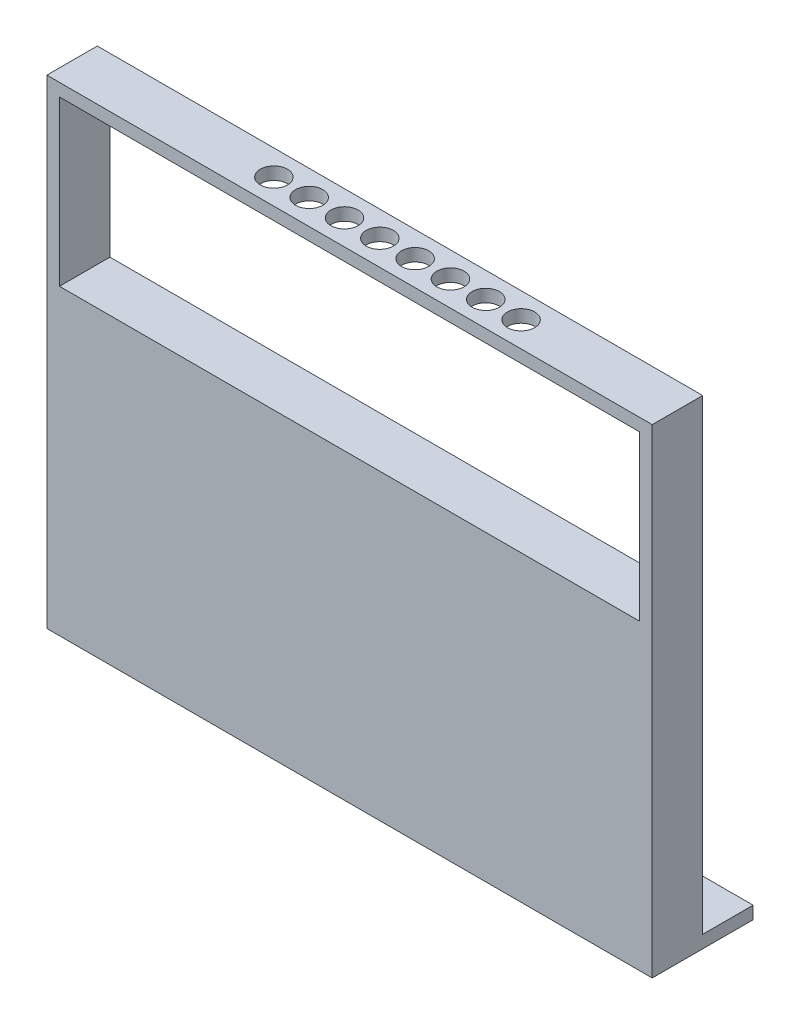
ISO-10303-21;
HEADER;
FILE_DESCRIPTION(('STEP AP214'),'2;1');
FILE_NAME('part.step','',(''),(''),'','','');
FILE_SCHEMA(('AUTOMOTIVE_DESIGN { 1 0 10303 214 1 1 1 1 }'));
ENDSEC;
DATA;
#1=APPLICATION_CONTEXT('core data for automotive mechanical design processes');
#2=APPLICATION_PROTOCOL_DEFINITION('international standard','automotive_design',2000,#1);
#3=PRODUCT_CONTEXT('',#1,'mechanical');
#4=PRODUCT('Part','Part','',(#3));
#5=PRODUCT_RELATED_PRODUCT_CATEGORY('part','',(#4));
#6=PRODUCT_DEFINITION_FORMATION('','',#4);
#7=PRODUCT_DEFINITION_CONTEXT('part definition',#1,'design');
#8=PRODUCT_DEFINITION('design','',#6,#7);
#9=PRODUCT_DEFINITION_SHAPE('','',#8);
#10=(LENGTH_UNIT() NAMED_UNIT(*) SI_UNIT(.MILLI.,.METRE.));
#11=(NAMED_UNIT(*) PLANE_ANGLE_UNIT() SI_UNIT($,.RADIAN.));
#12=(NAMED_UNIT(*) SI_UNIT($,.STERADIAN.) SOLID_ANGLE_UNIT());
#13=UNCERTAINTY_MEASURE_WITH_UNIT(LENGTH_MEASURE(1.E-05),#10,'distance_accuracy_value','');
#14=(GEOMETRIC_REPRESENTATION_CONTEXT(3) GLOBAL_UNCERTAINTY_ASSIGNED_CONTEXT((#13)) GLOBAL_UNIT_ASSIGNED_CONTEXT((#10,
#11,#12)) REPRESENTATION_CONTEXT('',''));
#15=CARTESIAN_POINT('',(0.,0.,0.));
#16=DIRECTION('',(0.,0.,1.));
#17=DIRECTION('',(1.,0.,0.));
#18=AXIS2_PLACEMENT_3D('',#15,#16,#17);
#19=CARTESIAN_POINT('',(-76.2,76.2,-6.35));
#20=DIRECTION('',(0.,0.,1.));
#21=DIRECTION('',(1.,0.,0.));
#22=AXIS2_PLACEMENT_3D('',#19,#20,#21);
#23=PLANE('',#22);
#24=DIRECTION('',(-1.,0.,0.));
#25=VECTOR('',#24,1.);
#26=CARTESIAN_POINT('',(-76.2,76.2,-6.35));
#27=LINE('',#26,#25);
#28=CARTESIAN_POINT('',(73.025,76.2,-6.34999999999999));
#29=VERTEX_POINT('',#28);
#30=CARTESIAN_POINT('',(-73.025,76.2,-6.35));
#31=VERTEX_POINT('',#30);
#32=EDGE_CURVE('E212',#29,#31,#27,.T.);
#33=ORIENTED_EDGE('',*,*,#32,.F.);
#34=DIRECTION('',(0.,1.,0.));
#35=VECTOR('',#34,1.);
#36=CARTESIAN_POINT('',(73.025,76.2,-6.34999999999999));
#37=LINE('',#36,#35);
#38=CARTESIAN_POINT('',(73.025,117.475,-6.34999999999999));
#39=VERTEX_POINT('',#38);
#40=EDGE_CURVE('E253',#29,#39,#37,.T.);
#41=ORIENTED_EDGE('',*,*,#40,.T.);
#42=DIRECTION('',(-1.,0.,0.));
#43=VECTOR('',#42,1.);
#44=CARTESIAN_POINT('',(73.025,117.475,-6.34999999999999));
#45=LINE('',#44,#43);
#46=CARTESIAN_POINT('',(-73.025,117.475,-6.34999999999999));
#47=VERTEX_POINT('',#46);
#48=EDGE_CURVE('E147',#39,#47,#45,.T.);
#49=ORIENTED_EDGE('',*,*,#48,.T.);
#50=DIRECTION('',(0.,-1.,0.));
#51=VECTOR('',#50,1.);
#52=CARTESIAN_POINT('',(-73.025,117.475,-6.34999999999999));
#53=LINE('',#52,#51);
#54=EDGE_CURVE('E115',#47,#31,#53,.T.);
#55=ORIENTED_EDGE('',*,*,#54,.T.);
#56=EDGE_LOOP('',(#33,#41,#49,#55));
#57=FACE_BOUND('',#56,.T.);
#58=DIRECTION('',(1.,0.,0.));
#59=VECTOR('',#58,1.);
#60=CARTESIAN_POINT('',(-76.2,3.175,-6.35));
#61=LINE('',#60,#59);
#62=CARTESIAN_POINT('',(-76.2,3.17500000000003,-6.35));
#63=VERTEX_POINT('',#62);
#64=CARTESIAN_POINT('',(76.2,3.175,-6.35));
#65=VERTEX_POINT('',#64);
#66=EDGE_CURVE('E196',#63,#65,#61,.T.);
#67=ORIENTED_EDGE('',*,*,#66,.F.);
#68=DIRECTION('',(0.,-1.,0.));
#69=VECTOR('',#68,1.);
#70=CARTESIAN_POINT('',(-76.2,76.2,-6.35));
#71=LINE('',#70,#69);
#72=CARTESIAN_POINT('',(-76.2,120.65,-6.34999999999999));
#73=VERTEX_POINT('',#72);
#74=EDGE_CURVE('E41',#73,#63,#71,.T.);
#75=ORIENTED_EDGE('',*,*,#74,.F.);
#76=DIRECTION('',(1.,0.,0.));
#77=VECTOR('',#76,1.);
#78=CARTESIAN_POINT('',(-76.2,120.65,-6.34999999999999));
#79=LINE('',#78,#77);
#80=CARTESIAN_POINT('',(76.2,120.65,-6.34999999999999));
#81=VERTEX_POINT('',#80);
#82=EDGE_CURVE('E137',#73,#81,#79,.T.);
#83=ORIENTED_EDGE('',*,*,#82,.T.);
#84=DIRECTION('',(0.,-1.,0.));
#85=VECTOR('',#84,1.);
#86=CARTESIAN_POINT('',(76.2,76.2,-6.35));
#87=LINE('',#86,#85);
#88=EDGE_CURVE('E11',#81,#65,#87,.T.);
#89=ORIENTED_EDGE('',*,*,#88,.T.);
#90=EDGE_LOOP('',(#67,#75,#83,#89));
#91=FACE_BOUND('',#90,.T.);
#92=ADVANCED_FACE('F33',(#57,#91),#23,.F.);
#93=CARTESIAN_POINT('',(76.2,76.2,6.35));
#94=DIRECTION('',(-1.,0.,0.));
#95=DIRECTION('',(0.,0.,1.));
#96=AXIS2_PLACEMENT_3D('',#93,#94,#95);
#97=PLANE('',#96);
#98=DIRECTION('',(0.,0.,-1.));
#99=VECTOR('',#98,1.);
#100=CARTESIAN_POINT('',(76.2,0.,6.35));
#101=LINE('',#100,#99);
#102=CARTESIAN_POINT('',(76.2,0.,6.35));
#103=VERTEX_POINT('',#102);
#104=CARTESIAN_POINT('',(76.2,0.,-19.05));
#105=VERTEX_POINT('',#104);
#106=EDGE_CURVE('E211',#103,#105,#101,.T.);
#107=ORIENTED_EDGE('',*,*,#106,.T.);
#108=DIRECTION('',(0.,-1.,0.));
#109=VECTOR('',#108,1.);
#110=CARTESIAN_POINT('',(76.2,3.175,-19.05));
#111=LINE('',#110,#109);
#112=CARTESIAN_POINT('',(76.2,3.175,-19.05));
#113=VERTEX_POINT('',#112);
#114=EDGE_CURVE('E208',#113,#105,#111,.T.);
#115=ORIENTED_EDGE('',*,*,#114,.F.);
#116=DIRECTION('',(0.,0.,-1.));
#117=VECTOR('',#116,1.);
#118=CARTESIAN_POINT('',(76.2,3.175,-6.35));
#119=LINE('',#118,#117);
#120=EDGE_CURVE('E199',#65,#113,#119,.T.);
#121=ORIENTED_EDGE('',*,*,#120,.F.);
#122=ORIENTED_EDGE('',*,*,#88,.F.);
#123=DIRECTION('',(0.,0.,1.));
#124=VECTOR('',#123,1.);
#125=CARTESIAN_POINT('',(76.2,120.65,-165.1));
#126=LINE('',#125,#124);
#127=CARTESIAN_POINT('',(76.2,120.65,6.35));
#128=VERTEX_POINT('',#127);
#129=EDGE_CURVE('E148',#81,#128,#126,.T.);
#130=ORIENTED_EDGE('',*,*,#129,.T.);
#131=DIRECTION('',(0.,-1.,0.));
#132=VECTOR('',#131,1.);
#133=CARTESIAN_POINT('',(76.2,76.2,6.35));
#134=LINE('',#133,#132);
#135=EDGE_CURVE('E216',#128,#103,#134,.T.);
#136=ORIENTED_EDGE('',*,*,#135,.T.);
#137=EDGE_LOOP('',(#107,#115,#121,#122,#130,#136));
#138=FACE_BOUND('',#137,.T.);
#139=ADVANCED_FACE('F35',(#138),#97,.F.);
#140=CARTESIAN_POINT('',(-76.2,76.2,6.35));
#141=DIRECTION('',(1.,0.,0.));
#142=DIRECTION('',(0.,0.,-1.));
#143=AXIS2_PLACEMENT_3D('',#140,#141,#142);
#144=PLANE('',#143);
#145=DIRECTION('',(0.,0.,1.));
#146=VECTOR('',#145,1.);
#147=CARTESIAN_POINT('',(-76.2,0.,6.35));
#148=LINE('',#147,#146);
#149=CARTESIAN_POINT('',(-76.2,0.,-19.05));
#150=VERTEX_POINT('',#149);
#151=CARTESIAN_POINT('',(-76.2,0.,6.35));
#152=VERTEX_POINT('',#151);
#153=EDGE_CURVE('E218',#150,#152,#148,.T.);
#154=ORIENTED_EDGE('',*,*,#153,.T.);
#155=DIRECTION('',(0.,-1.,0.));
#156=VECTOR('',#155,1.);
#157=CARTESIAN_POINT('',(-76.2,76.2,6.35));
#158=LINE('',#157,#156);
#159=CARTESIAN_POINT('',(-76.2,120.65,6.35));
#160=VERTEX_POINT('',#159);
#161=EDGE_CURVE('E223',#160,#152,#158,.T.);
#162=ORIENTED_EDGE('',*,*,#161,.F.);
#163=DIRECTION('',(0.,0.,1.));
#164=VECTOR('',#163,1.);
#165=CARTESIAN_POINT('',(-76.2,120.65,-165.1));
#166=LINE('',#165,#164);
#167=EDGE_CURVE('E144',#73,#160,#166,.T.);
#168=ORIENTED_EDGE('',*,*,#167,.F.);
#169=ORIENTED_EDGE('',*,*,#74,.T.);
#170=DIRECTION('',(0.,0.,1.));
#171=VECTOR('',#170,1.);
#172=CARTESIAN_POINT('',(-76.2,3.175,-12.7));
#173=LINE('',#172,#171);
#174=CARTESIAN_POINT('',(-76.2,3.175,-19.05));
#175=VERTEX_POINT('',#174);
#176=EDGE_CURVE('E193',#175,#63,#173,.T.);
#177=ORIENTED_EDGE('',*,*,#176,.F.);
#178=DIRECTION('',(0.,-1.,0.));
#179=VECTOR('',#178,1.);
#180=CARTESIAN_POINT('',(-76.2,3.175,-19.05));
#181=LINE('',#180,#179);
#182=EDGE_CURVE('E203',#175,#150,#181,.T.);
#183=ORIENTED_EDGE('',*,*,#182,.T.);
#184=EDGE_LOOP('',(#154,#162,#168,#169,#177,#183));
#185=FACE_BOUND('',#184,.T.);
#186=ADVANCED_FACE('F229',(#185),#144,.F.);
#187=CARTESIAN_POINT('',(-76.2,76.2,6.35));
#188=DIRECTION('',(0.,0.,-1.));
#189=DIRECTION('',(-1.,0.,0.));
#190=AXIS2_PLACEMENT_3D('',#187,#188,#189);
#191=PLANE('',#190);
#192=DIRECTION('',(1.,0.,0.));
#193=VECTOR('',#192,1.);
#194=CARTESIAN_POINT('',(-76.2,76.2,6.35));
#195=LINE('',#194,#193);
#196=CARTESIAN_POINT('',(-73.025,76.2,6.35));
#197=VERTEX_POINT('',#196);
#198=CARTESIAN_POINT('',(73.025,76.2,6.35));
#199=VERTEX_POINT('',#198);
#200=EDGE_CURVE('E48',#197,#199,#195,.T.);
#201=ORIENTED_EDGE('',*,*,#200,.F.);
#202=DIRECTION('',(0.,1.,0.));
#203=VECTOR('',#202,1.);
#204=CARTESIAN_POINT('',(-73.025,117.475,6.35));
#205=LINE('',#204,#203);
#206=CARTESIAN_POINT('',(-73.025,117.475,6.35));
#207=VERTEX_POINT('',#206);
#208=EDGE_CURVE('E113',#197,#207,#205,.T.);
#209=ORIENTED_EDGE('',*,*,#208,.T.);
#210=DIRECTION('',(1.,0.,0.));
#211=VECTOR('',#210,1.);
#212=CARTESIAN_POINT('',(73.025,117.475,6.35));
#213=LINE('',#212,#211);
#214=CARTESIAN_POINT('',(73.025,117.475,6.35));
#215=VERTEX_POINT('',#214);
#216=EDGE_CURVE('E121',#207,#215,#213,.T.);
#217=ORIENTED_EDGE('',*,*,#216,.T.);
#218=DIRECTION('',(0.,-1.,0.));
#219=VECTOR('',#218,1.);
#220=CARTESIAN_POINT('',(73.025,76.2,6.35));
#221=LINE('',#220,#219);
#222=EDGE_CURVE('E127',#215,#199,#221,.T.);
#223=ORIENTED_EDGE('',*,*,#222,.T.);
#224=EDGE_LOOP('',(#201,#209,#217,#223));
#225=FACE_BOUND('',#224,.T.);
#226=DIRECTION('',(1.,0.,0.));
#227=VECTOR('',#226,1.);
#228=CARTESIAN_POINT('',(-76.2,0.,6.35));
#229=LINE('',#228,#227);
#230=EDGE_CURVE('E214',#152,#103,#229,.T.);
#231=ORIENTED_EDGE('',*,*,#230,.T.);
#232=ORIENTED_EDGE('',*,*,#135,.F.);
#233=DIRECTION('',(-1.,0.,0.));
#234=VECTOR('',#233,1.);
#235=CARTESIAN_POINT('',(-76.2,120.65,6.35));
#236=LINE('',#235,#234);
#237=EDGE_CURVE('E141',#128,#160,#236,.T.);
#238=ORIENTED_EDGE('',*,*,#237,.T.);
#239=ORIENTED_EDGE('',*,*,#161,.T.);
#240=EDGE_LOOP('',(#231,#232,#238,#239));
#241=FACE_BOUND('',#240,.T.);
#242=ADVANCED_FACE('F129',(#225,#241),#191,.F.);
#243=CARTESIAN_POINT('',(0.,76.2,0.));
#244=DIRECTION('',(0.,-1.,0.));
#245=DIRECTION('',(0.,0.,-1.));
#246=AXIS2_PLACEMENT_3D('',#243,#244,#245);
#247=PLANE('',#246);
#248=ORIENTED_EDGE('',*,*,#200,.T.);
#249=DIRECTION('',(0.,0.,1.));
#250=VECTOR('',#249,1.);
#251=CARTESIAN_POINT('',(73.025,76.2,-165.1));
#252=LINE('',#251,#250);
#253=EDGE_CURVE('E151',#29,#199,#252,.T.);
#254=ORIENTED_EDGE('',*,*,#253,.F.);
#255=ORIENTED_EDGE('',*,*,#32,.T.);
#256=DIRECTION('',(0.,0.,1.));
#257=VECTOR('',#256,1.);
#258=CARTESIAN_POINT('',(-73.025,76.2,-165.1));
#259=LINE('',#258,#257);
#260=EDGE_CURVE('E53',#31,#197,#259,.T.);
#261=ORIENTED_EDGE('',*,*,#260,.T.);
#262=EDGE_LOOP('',(#248,#254,#255,#261));
#263=FACE_BOUND('',#262,.T.);
#264=ADVANCED_FACE('F347',(#263),#247,.F.);
#265=CARTESIAN_POINT('',(0.,0.,0.));
#266=DIRECTION('',(0.,-1.,0.));
#267=DIRECTION('',(0.,0.,-1.));
#268=AXIS2_PLACEMENT_3D('',#265,#266,#267);
#269=PLANE('',#268);
#270=ORIENTED_EDGE('',*,*,#106,.F.);
#271=ORIENTED_EDGE('',*,*,#230,.F.);
#272=ORIENTED_EDGE('',*,*,#153,.F.);
#273=DIRECTION('',(-1.,0.,0.));
#274=VECTOR('',#273,1.);
#275=CARTESIAN_POINT('',(76.2,0.,-19.05));
#276=LINE('',#275,#274);
#277=EDGE_CURVE('E190',#105,#150,#276,.T.);
#278=ORIENTED_EDGE('',*,*,#277,.F.);
#279=EDGE_LOOP('',(#270,#271,#272,#278));
#280=FACE_BOUND('',#279,.T.);
#281=CARTESIAN_POINT('',(-69.85,0.,-12.7));
#282=DIRECTION('',(0.,1.,0.));
#283=DIRECTION('',(0.,0.,1.));
#284=AXIS2_PLACEMENT_3D('',#281,#282,#283);
#285=CIRCLE('',#284,3.175);
#286=CARTESIAN_POINT('',(-69.85,0.,-9.52499999999999));
#287=VERTEX_POINT('',#286);
#288=EDGE_CURVE('E184',#287,#287,#285,.T.);
#289=ORIENTED_EDGE('',*,*,#288,.T.);
#290=EDGE_LOOP('',(#289));
#291=FACE_BOUND('',#290,.T.);
#292=CARTESIAN_POINT('',(-44.45,0.,-12.7));
#293=DIRECTION('',(0.,1.,0.));
#294=DIRECTION('',(0.,0.,1.));
#295=AXIS2_PLACEMENT_3D('',#292,#293,#294);
#296=CIRCLE('',#295,3.175);
#297=CARTESIAN_POINT('',(-44.45,0.,-9.52499999999999));
#298=VERTEX_POINT('',#297);
#299=EDGE_CURVE('E178',#298,#298,#296,.T.);
#300=ORIENTED_EDGE('',*,*,#299,.T.);
#301=EDGE_LOOP('',(#300));
#302=FACE_BOUND('',#301,.T.);
#303=CARTESIAN_POINT('',(-19.05,0.,-12.7));
#304=DIRECTION('',(0.,1.,0.));
#305=DIRECTION('',(0.,0.,1.));
#306=AXIS2_PLACEMENT_3D('',#303,#304,#305);
#307=CIRCLE('',#306,3.175);
#308=CARTESIAN_POINT('',(-19.05,0.,-9.52499999999999));
#309=VERTEX_POINT('',#308);
#310=EDGE_CURVE('E172',#309,#309,#307,.T.);
#311=ORIENTED_EDGE('',*,*,#310,.T.);
#312=EDGE_LOOP('',(#311));
#313=FACE_BOUND('',#312,.T.);
#314=CARTESIAN_POINT('',(6.34999999999997,0.,-12.7));
#315=DIRECTION('',(0.,1.,0.));
#316=DIRECTION('',(0.,0.,1.));
#317=AXIS2_PLACEMENT_3D('',#314,#315,#316);
#318=CIRCLE('',#317,3.175);
#319=CARTESIAN_POINT('',(6.34999999999997,0.,-9.52499999999999));
#320=VERTEX_POINT('',#319);
#321=EDGE_CURVE('E166',#320,#320,#318,.T.);
#322=ORIENTED_EDGE('',*,*,#321,.T.);
#323=EDGE_LOOP('',(#322));
#324=FACE_BOUND('',#323,.T.);
#325=CARTESIAN_POINT('',(31.75,0.,-12.7));
#326=DIRECTION('',(0.,1.,0.));
#327=DIRECTION('',(0.,0.,1.));
#328=AXIS2_PLACEMENT_3D('',#325,#326,#327);
#329=CIRCLE('',#328,3.175);
#330=CARTESIAN_POINT('',(31.75,0.,-9.52499999999999));
#331=VERTEX_POINT('',#330);
#332=EDGE_CURVE('E160',#331,#331,#329,.T.);
#333=ORIENTED_EDGE('',*,*,#332,.T.);
#334=EDGE_LOOP('',(#333));
#335=FACE_BOUND('',#334,.T.);
#336=CARTESIAN_POINT('',(57.15,0.,-12.7));
#337=DIRECTION('',(0.,1.,0.));
#338=DIRECTION('',(0.,0.,1.));
#339=AXIS2_PLACEMENT_3D('',#336,#337,#338);
#340=CIRCLE('',#339,3.175);
#341=CARTESIAN_POINT('',(57.15,0.,-9.52499999999999));
#342=VERTEX_POINT('',#341);
#343=EDGE_CURVE('E156',#342,#342,#340,.T.);
#344=ORIENTED_EDGE('',*,*,#343,.T.);
#345=EDGE_LOOP('',(#344));
#346=FACE_BOUND('',#345,.T.);
#347=ADVANCED_FACE('F247',(#280,#291,#302,#313,#324,#335,#346),#269,.T.);
#348=CARTESIAN_POINT('',(0.,3.175,0.));
#349=DIRECTION('',(0.,1.,0.));
#350=DIRECTION('',(0.,0.,1.));
#351=AXIS2_PLACEMENT_3D('',#348,#349,#350);
#352=PLANE('',#351);
#353=CARTESIAN_POINT('',(31.75,3.175,-12.7));
#354=DIRECTION('',(0.,1.,0.));
#355=DIRECTION('',(0.,0.,1.));
#356=AXIS2_PLACEMENT_3D('',#353,#354,#355);
#357=CIRCLE('',#356,3.175);
#358=CARTESIAN_POINT('',(31.75,3.175,-9.52499999999999));
#359=VERTEX_POINT('',#358);
#360=EDGE_CURVE('E163',#359,#359,#357,.T.);
#361=ORIENTED_EDGE('',*,*,#360,.F.);
#362=EDGE_LOOP('',(#361));
#363=FACE_BOUND('',#362,.T.);
#364=CARTESIAN_POINT('',(-19.05,3.175,-12.7));
#365=DIRECTION('',(0.,1.,0.));
#366=DIRECTION('',(0.,0.,1.));
#367=AXIS2_PLACEMENT_3D('',#364,#365,#366);
#368=CIRCLE('',#367,3.175);
#369=CARTESIAN_POINT('',(-19.05,3.175,-9.52499999999999));
#370=VERTEX_POINT('',#369);
#371=EDGE_CURVE('E175',#370,#370,#368,.T.);
#372=ORIENTED_EDGE('',*,*,#371,.F.);
#373=EDGE_LOOP('',(#372));
#374=FACE_BOUND('',#373,.T.);
#375=CARTESIAN_POINT('',(-69.85,3.175,-12.7));
#376=DIRECTION('',(0.,1.,0.));
#377=DIRECTION('',(0.,0.,1.));
#378=AXIS2_PLACEMENT_3D('',#375,#376,#377);
#379=CIRCLE('',#378,3.175);
#380=CARTESIAN_POINT('',(-69.85,3.175,-9.52499999999999));
#381=VERTEX_POINT('',#380);
#382=EDGE_CURVE('E187',#381,#381,#379,.T.);
#383=ORIENTED_EDGE('',*,*,#382,.F.);
#384=EDGE_LOOP('',(#383));
#385=FACE_BOUND('',#384,.T.);
#386=ORIENTED_EDGE('',*,*,#176,.T.);
#387=ORIENTED_EDGE('',*,*,#66,.T.);
#388=ORIENTED_EDGE('',*,*,#120,.T.);
#389=DIRECTION('',(-1.,0.,0.));
#390=VECTOR('',#389,1.);
#391=CARTESIAN_POINT('',(76.2,3.175,-19.05));
#392=LINE('',#391,#390);
#393=EDGE_CURVE('E201',#113,#175,#392,.T.);
#394=ORIENTED_EDGE('',*,*,#393,.T.);
#395=EDGE_LOOP('',(#386,#387,#388,#394));
#396=FACE_BOUND('',#395,.T.);
#397=CARTESIAN_POINT('',(-44.45,3.175,-12.7));
#398=DIRECTION('',(0.,1.,0.));
#399=DIRECTION('',(0.,0.,1.));
#400=AXIS2_PLACEMENT_3D('',#397,#398,#399);
#401=CIRCLE('',#400,3.175);
#402=CARTESIAN_POINT('',(-44.45,3.175,-9.52499999999999));
#403=VERTEX_POINT('',#402);
#404=EDGE_CURVE('E181',#403,#403,#401,.T.);
#405=ORIENTED_EDGE('',*,*,#404,.F.);
#406=EDGE_LOOP('',(#405));
#407=FACE_BOUND('',#406,.T.);
#408=CARTESIAN_POINT('',(6.34999999999997,3.175,-12.7));
#409=DIRECTION('',(0.,1.,0.));
#410=DIRECTION('',(0.,0.,1.));
#411=AXIS2_PLACEMENT_3D('',#408,#409,#410);
#412=CIRCLE('',#411,3.175);
#413=CARTESIAN_POINT('',(6.34999999999997,3.175,-9.52499999999999));
#414=VERTEX_POINT('',#413);
#415=EDGE_CURVE('E169',#414,#414,#412,.T.);
#416=ORIENTED_EDGE('',*,*,#415,.F.);
#417=EDGE_LOOP('',(#416));
#418=FACE_BOUND('',#417,.T.);
#419=CARTESIAN_POINT('',(57.15,3.175,-12.7));
#420=DIRECTION('',(0.,1.,0.));
#421=DIRECTION('',(0.,0.,1.));
#422=AXIS2_PLACEMENT_3D('',#419,#420,#421);
#423=CIRCLE('',#422,3.175);
#424=CARTESIAN_POINT('',(57.15,3.175,-9.52499999999999));
#425=VERTEX_POINT('',#424);
#426=EDGE_CURVE('E157',#425,#425,#423,.T.);
#427=ORIENTED_EDGE('',*,*,#426,.F.);
#428=EDGE_LOOP('',(#427));
#429=FACE_BOUND('',#428,.T.);
#430=ADVANCED_FACE('F234',(#363,#374,#385,#396,#407,#418,#429),#352,.T.);
#431=CARTESIAN_POINT('',(76.2,3.175,-19.05));
#432=DIRECTION('',(0.,0.,1.));
#433=DIRECTION('',(1.,0.,0.));
#434=AXIS2_PLACEMENT_3D('',#431,#432,#433);
#435=PLANE('',#434);
#436=ORIENTED_EDGE('',*,*,#277,.T.);
#437=ORIENTED_EDGE('',*,*,#182,.F.);
#438=ORIENTED_EDGE('',*,*,#393,.F.);
#439=ORIENTED_EDGE('',*,*,#114,.T.);
#440=EDGE_LOOP('',(#436,#437,#438,#439));
#441=FACE_BOUND('',#440,.T.);
#442=ADVANCED_FACE('F241',(#441),#435,.F.);
#443=CARTESIAN_POINT('',(-69.85,3.175,-12.7));
#444=DIRECTION('',(0.,-1.,0.));
#445=DIRECTION('',(0.,0.,-1.));
#446=AXIS2_PLACEMENT_3D('',#443,#444,#445);
#447=CYLINDRICAL_SURFACE('',#446,3.175);
#448=ORIENTED_EDGE('',*,*,#382,.T.);
#449=EDGE_LOOP('',(#448));
#450=FACE_BOUND('',#449,.T.);
#451=ORIENTED_EDGE('',*,*,#288,.F.);
#452=EDGE_LOOP('',(#451));
#453=FACE_BOUND('',#452,.T.);
#454=ADVANCED_FACE('F354',(#450,#453),#447,.F.);
#455=CARTESIAN_POINT('',(-44.45,3.175,-12.7));
#456=DIRECTION('',(0.,-1.,0.));
#457=DIRECTION('',(0.,0.,-1.));
#458=AXIS2_PLACEMENT_3D('',#455,#456,#457);
#459=CYLINDRICAL_SURFACE('',#458,3.175);
#460=ORIENTED_EDGE('',*,*,#404,.T.);
#461=EDGE_LOOP('',(#460));
#462=FACE_BOUND('',#461,.T.);
#463=ORIENTED_EDGE('',*,*,#299,.F.);
#464=EDGE_LOOP('',(#463));
#465=FACE_BOUND('',#464,.T.);
#466=ADVANCED_FACE('F360',(#462,#465),#459,.F.);
#467=CARTESIAN_POINT('',(-19.05,3.175,-12.7));
#468=DIRECTION('',(0.,-1.,0.));
#469=DIRECTION('',(0.,0.,-1.));
#470=AXIS2_PLACEMENT_3D('',#467,#468,#469);
#471=CYLINDRICAL_SURFACE('',#470,3.175);
#472=ORIENTED_EDGE('',*,*,#371,.T.);
#473=EDGE_LOOP('',(#472));
#474=FACE_BOUND('',#473,.T.);
#475=ORIENTED_EDGE('',*,*,#310,.F.);
#476=EDGE_LOOP('',(#475));
#477=FACE_BOUND('',#476,.T.);
#478=ADVANCED_FACE('F364',(#474,#477),#471,.F.);
#479=CARTESIAN_POINT('',(6.34999999999997,3.175,-12.7));
#480=DIRECTION('',(0.,-1.,0.));
#481=DIRECTION('',(0.,0.,-1.));
#482=AXIS2_PLACEMENT_3D('',#479,#480,#481);
#483=CYLINDRICAL_SURFACE('',#482,3.175);
#484=ORIENTED_EDGE('',*,*,#415,.T.);
#485=EDGE_LOOP('',(#484));
#486=FACE_BOUND('',#485,.T.);
#487=ORIENTED_EDGE('',*,*,#321,.F.);
#488=EDGE_LOOP('',(#487));
#489=FACE_BOUND('',#488,.T.);
#490=ADVANCED_FACE('F368',(#486,#489),#483,.F.);
#491=CARTESIAN_POINT('',(31.75,3.175,-12.7));
#492=DIRECTION('',(0.,-1.,0.));
#493=DIRECTION('',(0.,0.,-1.));
#494=AXIS2_PLACEMENT_3D('',#491,#492,#493);
#495=CYLINDRICAL_SURFACE('',#494,3.175);
#496=ORIENTED_EDGE('',*,*,#360,.T.);
#497=EDGE_LOOP('',(#496));
#498=FACE_BOUND('',#497,.T.);
#499=ORIENTED_EDGE('',*,*,#332,.F.);
#500=EDGE_LOOP('',(#499));
#501=FACE_BOUND('',#500,.T.);
#502=ADVANCED_FACE('F372',(#498,#501),#495,.F.);
#503=CARTESIAN_POINT('',(57.15,3.175,-12.7));
#504=DIRECTION('',(0.,-1.,0.));
#505=DIRECTION('',(0.,0.,-1.));
#506=AXIS2_PLACEMENT_3D('',#503,#504,#505);
#507=CYLINDRICAL_SURFACE('',#506,3.175);
#508=ORIENTED_EDGE('',*,*,#426,.T.);
#509=EDGE_LOOP('',(#508));
#510=FACE_BOUND('',#509,.T.);
#511=ORIENTED_EDGE('',*,*,#343,.F.);
#512=EDGE_LOOP('',(#511));
#513=FACE_BOUND('',#512,.T.);
#514=ADVANCED_FACE('F308',(#510,#513),#507,.F.);
#515=CARTESIAN_POINT('',(-76.2,120.65,-165.1));
#516=DIRECTION('',(0.,1.,0.));
#517=DIRECTION('',(0.,0.,1.));
#518=AXIS2_PLACEMENT_3D('',#515,#516,#517);
#519=PLANE('',#518);
#520=CARTESIAN_POINT('',(-16.51,120.65,0.));
#521=DIRECTION('',(0.,1.,0.));
#522=DIRECTION('',(0.,0.,1.));
#523=AXIS2_PLACEMENT_3D('',#520,#521,#522);
#524=CIRCLE('',#523,3.429);
#525=CARTESIAN_POINT('',(-16.51,120.65,3.429));
#526=VERTEX_POINT('',#525);
#527=EDGE_CURVE('E259',#526,#526,#524,.T.);
#528=ORIENTED_EDGE('',*,*,#527,.F.);
#529=EDGE_LOOP('',(#528));
#530=FACE_BOUND('',#529,.T.);
#531=CARTESIAN_POINT('',(-7.62000000000002,120.65,0.));
#532=DIRECTION('',(0.,1.,0.));
#533=DIRECTION('',(0.,0.,1.));
#534=AXIS2_PLACEMENT_3D('',#531,#532,#533);
#535=CIRCLE('',#534,3.429);
#536=CARTESIAN_POINT('',(-7.62000000000002,120.65,3.429));
#537=VERTEX_POINT('',#536);
#538=EDGE_CURVE('E294',#537,#537,#535,.T.);
#539=ORIENTED_EDGE('',*,*,#538,.F.);
#540=EDGE_LOOP('',(#539));
#541=FACE_BOUND('',#540,.T.);
#542=CARTESIAN_POINT('',(1.26999999999998,120.65,0.));
#543=DIRECTION('',(0.,1.,0.));
#544=DIRECTION('',(0.,0.,1.));
#545=AXIS2_PLACEMENT_3D('',#542,#543,#544);
#546=CIRCLE('',#545,3.429);
#547=CARTESIAN_POINT('',(1.26999999999998,120.65,3.429));
#548=VERTEX_POINT('',#547);
#549=EDGE_CURVE('E288',#548,#548,#546,.T.);
#550=ORIENTED_EDGE('',*,*,#549,.F.);
#551=EDGE_LOOP('',(#550));
#552=FACE_BOUND('',#551,.T.);
#553=CARTESIAN_POINT('',(10.16,120.65,0.));
#554=DIRECTION('',(0.,1.,0.));
#555=DIRECTION('',(0.,0.,1.));
#556=AXIS2_PLACEMENT_3D('',#553,#554,#555);
#557=CIRCLE('',#556,3.429);
#558=CARTESIAN_POINT('',(10.16,120.65,3.429));
#559=VERTEX_POINT('',#558);
#560=EDGE_CURVE('E282',#559,#559,#557,.T.);
#561=ORIENTED_EDGE('',*,*,#560,.F.);
#562=EDGE_LOOP('',(#561));
#563=FACE_BOUND('',#562,.T.);
#564=CARTESIAN_POINT('',(19.05,120.65,0.));
#565=DIRECTION('',(0.,1.,0.));
#566=DIRECTION('',(0.,0.,1.));
#567=AXIS2_PLACEMENT_3D('',#564,#565,#566);
#568=CIRCLE('',#567,3.429);
#569=CARTESIAN_POINT('',(19.05,120.65,3.429));
#570=VERTEX_POINT('',#569);
#571=EDGE_CURVE('E276',#570,#570,#568,.T.);
#572=ORIENTED_EDGE('',*,*,#571,.F.);
#573=EDGE_LOOP('',(#572));
#574=FACE_BOUND('',#573,.T.);
#575=CARTESIAN_POINT('',(27.94,120.65,0.));
#576=DIRECTION('',(0.,1.,0.));
#577=DIRECTION('',(0.,0.,1.));
#578=AXIS2_PLACEMENT_3D('',#575,#576,#577);
#579=CIRCLE('',#578,3.429);
#580=CARTESIAN_POINT('',(27.94,120.65,3.429));
#581=VERTEX_POINT('',#580);
#582=EDGE_CURVE('E270',#581,#581,#579,.T.);
#583=ORIENTED_EDGE('',*,*,#582,.F.);
#584=EDGE_LOOP('',(#583));
#585=FACE_BOUND('',#584,.T.);
#586=CARTESIAN_POINT('',(36.83,120.65,0.));
#587=DIRECTION('',(0.,1.,0.));
#588=DIRECTION('',(0.,0.,1.));
#589=AXIS2_PLACEMENT_3D('',#586,#587,#588);
#590=CIRCLE('',#589,3.429);
#591=CARTESIAN_POINT('',(36.83,120.65,3.429));
#592=VERTEX_POINT('',#591);
#593=EDGE_CURVE('E264',#592,#592,#590,.T.);
#594=ORIENTED_EDGE('',*,*,#593,.F.);
#595=EDGE_LOOP('',(#594));
#596=FACE_BOUND('',#595,.T.);
#597=CARTESIAN_POINT('',(-25.4,120.65,0.));
#598=DIRECTION('',(0.,1.,0.));
#599=DIRECTION('',(0.,0.,1.));
#600=AXIS2_PLACEMENT_3D('',#597,#598,#599);
#601=CIRCLE('',#600,3.429);
#602=CARTESIAN_POINT('',(-25.4,120.65,3.429));
#603=VERTEX_POINT('',#602);
#604=EDGE_CURVE('E131',#603,#603,#601,.T.);
#605=ORIENTED_EDGE('',*,*,#604,.F.);
#606=EDGE_LOOP('',(#605));
#607=FACE_BOUND('',#606,.T.);
#608=ORIENTED_EDGE('',*,*,#82,.F.);
#609=ORIENTED_EDGE('',*,*,#167,.T.);
#610=ORIENTED_EDGE('',*,*,#237,.F.);
#611=ORIENTED_EDGE('',*,*,#129,.F.);
#612=EDGE_LOOP('',(#608,#609,#610,#611));
#613=FACE_BOUND('',#612,.T.);
#614=ADVANCED_FACE('F252',(#530,#541,#552,#563,#574,#585,#596,#607,#613),#519,.T.);
#615=CARTESIAN_POINT('',(73.025,76.2,-165.1));
#616=DIRECTION('',(-1.,0.,0.));
#617=DIRECTION('',(0.,0.,1.));
#618=AXIS2_PLACEMENT_3D('',#615,#616,#617);
#619=PLANE('',#618);
#620=ORIENTED_EDGE('',*,*,#40,.F.);
#621=ORIENTED_EDGE('',*,*,#253,.T.);
#622=ORIENTED_EDGE('',*,*,#222,.F.);
#623=DIRECTION('',(0.,0.,1.));
#624=VECTOR('',#623,1.);
#625=CARTESIAN_POINT('',(73.025,117.475,-165.1));
#626=LINE('',#625,#624);
#627=EDGE_CURVE('E118',#39,#215,#626,.T.);
#628=ORIENTED_EDGE('',*,*,#627,.F.);
#629=EDGE_LOOP('',(#620,#621,#622,#628));
#630=FACE_BOUND('',#629,.T.);
#631=ADVANCED_FACE('F307',(#630),#619,.T.);
#632=CARTESIAN_POINT('',(73.025,117.475,-165.1));
#633=DIRECTION('',(0.,-1.,0.));
#634=DIRECTION('',(1.,0.,0.));
#635=AXIS2_PLACEMENT_3D('',#632,#633,#634);
#636=PLANE('',#635);
#637=CARTESIAN_POINT('',(-16.51,117.475,0.));
#638=DIRECTION('',(0.,-1.,0.));
#639=DIRECTION('',(1.,0.,0.));
#640=AXIS2_PLACEMENT_3D('',#637,#638,#639);
#641=CIRCLE('',#640,3.429);
#642=CARTESIAN_POINT('',(-13.081,117.475,0.));
#643=VERTEX_POINT('',#642);
#644=EDGE_CURVE('E297',#643,#643,#641,.F.);
#645=ORIENTED_EDGE('',*,*,#644,.T.);
#646=EDGE_LOOP('',(#645));
#647=FACE_BOUND('',#646,.T.);
#648=CARTESIAN_POINT('',(-7.62000000000002,117.475,0.));
#649=DIRECTION('',(0.,-1.,0.));
#650=DIRECTION('',(1.,0.,0.));
#651=AXIS2_PLACEMENT_3D('',#648,#649,#650);
#652=CIRCLE('',#651,3.429);
#653=CARTESIAN_POINT('',(-4.19100000000002,117.475,0.));
#654=VERTEX_POINT('',#653);
#655=EDGE_CURVE('E291',#654,#654,#652,.F.);
#656=ORIENTED_EDGE('',*,*,#655,.T.);
#657=EDGE_LOOP('',(#656));
#658=FACE_BOUND('',#657,.T.);
#659=CARTESIAN_POINT('',(1.26999999999998,117.475,0.));
#660=DIRECTION('',(0.,-1.,0.));
#661=DIRECTION('',(1.,0.,0.));
#662=AXIS2_PLACEMENT_3D('',#659,#660,#661);
#663=CIRCLE('',#662,3.429);
#664=CARTESIAN_POINT('',(4.69899999999997,117.475,0.));
#665=VERTEX_POINT('',#664);
#666=EDGE_CURVE('E285',#665,#665,#663,.F.);
#667=ORIENTED_EDGE('',*,*,#666,.T.);
#668=EDGE_LOOP('',(#667));
#669=FACE_BOUND('',#668,.T.);
#670=CARTESIAN_POINT('',(10.16,117.475,0.));
#671=DIRECTION('',(0.,-1.,0.));
#672=DIRECTION('',(1.,0.,0.));
#673=AXIS2_PLACEMENT_3D('',#670,#671,#672);
#674=CIRCLE('',#673,3.429);
#675=CARTESIAN_POINT('',(13.589,117.475,0.));
#676=VERTEX_POINT('',#675);
#677=EDGE_CURVE('E279',#676,#676,#674,.F.);
#678=ORIENTED_EDGE('',*,*,#677,.T.);
#679=EDGE_LOOP('',(#678));
#680=FACE_BOUND('',#679,.T.);
#681=CARTESIAN_POINT('',(19.05,117.475,0.));
#682=DIRECTION('',(0.,-1.,0.));
#683=DIRECTION('',(1.,0.,0.));
#684=AXIS2_PLACEMENT_3D('',#681,#682,#683);
#685=CIRCLE('',#684,3.429);
#686=CARTESIAN_POINT('',(22.479,117.475,0.));
#687=VERTEX_POINT('',#686);
#688=EDGE_CURVE('E273',#687,#687,#685,.F.);
#689=ORIENTED_EDGE('',*,*,#688,.T.);
#690=EDGE_LOOP('',(#689));
#691=FACE_BOUND('',#690,.T.);
#692=CARTESIAN_POINT('',(27.94,117.475,0.));
#693=DIRECTION('',(0.,-1.,0.));
#694=DIRECTION('',(1.,0.,0.));
#695=AXIS2_PLACEMENT_3D('',#692,#693,#694);
#696=CIRCLE('',#695,3.429);
#697=CARTESIAN_POINT('',(31.369,117.475,0.));
#698=VERTEX_POINT('',#697);
#699=EDGE_CURVE('E267',#698,#698,#696,.F.);
#700=ORIENTED_EDGE('',*,*,#699,.T.);
#701=EDGE_LOOP('',(#700));
#702=FACE_BOUND('',#701,.T.);
#703=CARTESIAN_POINT('',(36.83,117.475,0.));
#704=DIRECTION('',(0.,-1.,0.));
#705=DIRECTION('',(1.,0.,0.));
#706=AXIS2_PLACEMENT_3D('',#703,#704,#705);
#707=CIRCLE('',#706,3.429);
#708=CARTESIAN_POINT('',(40.259,117.475,0.));
#709=VERTEX_POINT('',#708);
#710=EDGE_CURVE('E261',#709,#709,#707,.F.);
#711=ORIENTED_EDGE('',*,*,#710,.T.);
#712=EDGE_LOOP('',(#711));
#713=FACE_BOUND('',#712,.T.);
#714=CARTESIAN_POINT('',(-25.4,117.475,0.));
#715=DIRECTION('',(0.,-1.,0.));
#716=DIRECTION('',(1.,0.,0.));
#717=AXIS2_PLACEMENT_3D('',#714,#715,#716);
#718=CIRCLE('',#717,3.429);
#719=CARTESIAN_POINT('',(-21.971,117.475,0.));
#720=VERTEX_POINT('',#719);
#721=EDGE_CURVE('E134',#720,#720,#718,.F.);
#722=ORIENTED_EDGE('',*,*,#721,.T.);
#723=EDGE_LOOP('',(#722));
#724=FACE_BOUND('',#723,.T.);
#725=ORIENTED_EDGE('',*,*,#48,.F.);
#726=ORIENTED_EDGE('',*,*,#627,.T.);
#727=ORIENTED_EDGE('',*,*,#216,.F.);
#728=DIRECTION('',(0.,0.,1.));
#729=VECTOR('',#728,1.);
#730=CARTESIAN_POINT('',(-73.025,117.475,-165.1));
#731=LINE('',#730,#729);
#732=EDGE_CURVE('E109',#47,#207,#731,.T.);
#733=ORIENTED_EDGE('',*,*,#732,.F.);
#734=EDGE_LOOP('',(#725,#726,#727,#733));
#735=FACE_BOUND('',#734,.T.);
#736=ADVANCED_FACE('F122',(#647,#658,#669,#680,#691,#702,#713,#724,#735),#636,.T.);
#737=CARTESIAN_POINT('',(-73.025,117.475,-165.1));
#738=DIRECTION('',(1.,0.,0.));
#739=DIRECTION('',(0.,0.,-1.));
#740=AXIS2_PLACEMENT_3D('',#737,#738,#739);
#741=PLANE('',#740);
#742=ORIENTED_EDGE('',*,*,#54,.F.);
#743=ORIENTED_EDGE('',*,*,#732,.T.);
#744=ORIENTED_EDGE('',*,*,#208,.F.);
#745=ORIENTED_EDGE('',*,*,#260,.F.);
#746=EDGE_LOOP('',(#742,#743,#744,#745));
#747=FACE_BOUND('',#746,.T.);
#748=ADVANCED_FACE('F111',(#747),#741,.T.);
#749=CARTESIAN_POINT('',(-25.4,-0.001000000000001,0.));
#750=DIRECTION('',(0.,1.,0.));
#751=DIRECTION('',(0.,0.,1.));
#752=AXIS2_PLACEMENT_3D('',#749,#750,#751);
#753=CYLINDRICAL_SURFACE('',#752,3.429);
#754=ORIENTED_EDGE('',*,*,#721,.F.);
#755=EDGE_LOOP('',(#754));
#756=FACE_BOUND('',#755,.T.);
#757=ORIENTED_EDGE('',*,*,#604,.T.);
#758=EDGE_LOOP('',(#757));
#759=FACE_BOUND('',#758,.T.);
#760=ADVANCED_FACE('F324',(#756,#759),#753,.F.);
#761=CARTESIAN_POINT('',(36.83,-0.001000000000001,0.));
#762=DIRECTION('',(0.,1.,0.));
#763=DIRECTION('',(0.,0.,1.));
#764=AXIS2_PLACEMENT_3D('',#761,#762,#763);
#765=CYLINDRICAL_SURFACE('',#764,3.429);
#766=ORIENTED_EDGE('',*,*,#710,.F.);
#767=EDGE_LOOP('',(#766));
#768=FACE_BOUND('',#767,.T.);
#769=ORIENTED_EDGE('',*,*,#593,.T.);
#770=EDGE_LOOP('',(#769));
#771=FACE_BOUND('',#770,.T.);
#772=ADVANCED_FACE('F326',(#768,#771),#765,.F.);
#773=CARTESIAN_POINT('',(27.94,-0.001000000000001,0.));
#774=DIRECTION('',(0.,1.,0.));
#775=DIRECTION('',(0.,0.,1.));
#776=AXIS2_PLACEMENT_3D('',#773,#774,#775);
#777=CYLINDRICAL_SURFACE('',#776,3.429);
#778=ORIENTED_EDGE('',*,*,#699,.F.);
#779=EDGE_LOOP('',(#778));
#780=FACE_BOUND('',#779,.T.);
#781=ORIENTED_EDGE('',*,*,#582,.T.);
#782=EDGE_LOOP('',(#781));
#783=FACE_BOUND('',#782,.T.);
#784=ADVANCED_FACE('F333',(#780,#783),#777,.F.);
#785=CARTESIAN_POINT('',(19.05,-0.001000000000001,0.));
#786=DIRECTION('',(0.,1.,0.));
#787=DIRECTION('',(0.,0.,1.));
#788=AXIS2_PLACEMENT_3D('',#785,#786,#787);
#789=CYLINDRICAL_SURFACE('',#788,3.429);
#790=ORIENTED_EDGE('',*,*,#688,.F.);
#791=EDGE_LOOP('',(#790));
#792=FACE_BOUND('',#791,.T.);
#793=ORIENTED_EDGE('',*,*,#571,.T.);
#794=EDGE_LOOP('',(#793));
#795=FACE_BOUND('',#794,.T.);
#796=ADVANCED_FACE('F530',(#792,#795),#789,.F.);
#797=CARTESIAN_POINT('',(10.16,-0.001000000000001,0.));
#798=DIRECTION('',(0.,1.,0.));
#799=DIRECTION('',(0.,0.,1.));
#800=AXIS2_PLACEMENT_3D('',#797,#798,#799);
#801=CYLINDRICAL_SURFACE('',#800,3.429);
#802=ORIENTED_EDGE('',*,*,#677,.F.);
#803=EDGE_LOOP('',(#802));
#804=FACE_BOUND('',#803,.T.);
#805=ORIENTED_EDGE('',*,*,#560,.T.);
#806=EDGE_LOOP('',(#805));
#807=FACE_BOUND('',#806,.T.);
#808=ADVANCED_FACE('F539',(#804,#807),#801,.F.);
#809=CARTESIAN_POINT('',(1.26999999999998,-0.001000000000001,0.));
#810=DIRECTION('',(0.,1.,0.));
#811=DIRECTION('',(0.,0.,1.));
#812=AXIS2_PLACEMENT_3D('',#809,#810,#811);
#813=CYLINDRICAL_SURFACE('',#812,3.429);
#814=ORIENTED_EDGE('',*,*,#666,.F.);
#815=EDGE_LOOP('',(#814));
#816=FACE_BOUND('',#815,.T.);
#817=ORIENTED_EDGE('',*,*,#549,.T.);
#818=EDGE_LOOP('',(#817));
#819=FACE_BOUND('',#818,.T.);
#820=ADVANCED_FACE('F548',(#816,#819),#813,.F.);
#821=CARTESIAN_POINT('',(-7.62000000000002,-0.001000000000001,0.));
#822=DIRECTION('',(0.,1.,0.));
#823=DIRECTION('',(0.,0.,1.));
#824=AXIS2_PLACEMENT_3D('',#821,#822,#823);
#825=CYLINDRICAL_SURFACE('',#824,3.429);
#826=ORIENTED_EDGE('',*,*,#655,.F.);
#827=EDGE_LOOP('',(#826));
#828=FACE_BOUND('',#827,.T.);
#829=ORIENTED_EDGE('',*,*,#538,.T.);
#830=EDGE_LOOP('',(#829));
#831=FACE_BOUND('',#830,.T.);
#832=ADVANCED_FACE('F557',(#828,#831),#825,.F.);
#833=CARTESIAN_POINT('',(-16.51,-0.001000000000001,0.));
#834=DIRECTION('',(0.,1.,0.));
#835=DIRECTION('',(0.,0.,1.));
#836=AXIS2_PLACEMENT_3D('',#833,#834,#835);
#837=CYLINDRICAL_SURFACE('',#836,3.429);
#838=ORIENTED_EDGE('',*,*,#644,.F.);
#839=EDGE_LOOP('',(#838));
#840=FACE_BOUND('',#839,.T.);
#841=ORIENTED_EDGE('',*,*,#527,.T.);
#842=EDGE_LOOP('',(#841));
#843=FACE_BOUND('',#842,.T.);
#844=ADVANCED_FACE('F303',(#840,#843),#837,.F.);
#845=CLOSED_SHELL('',(#92,#139,#186,#242,#264,#347,#430,#442,#454,#466,#478,#490,#502,#514,#614,
#631,#736,#748,#760,#772,#784,#796,#808,#820,#832,#844));
#846=MANIFOLD_SOLID_BREP('B2',#845);
#847=ADVANCED_BREP_SHAPE_REPRESENTATION('',(#18,#846),#14);
#848=SHAPE_DEFINITION_REPRESENTATION(#9,#847);
ENDSEC;
END-ISO-10303-21;
